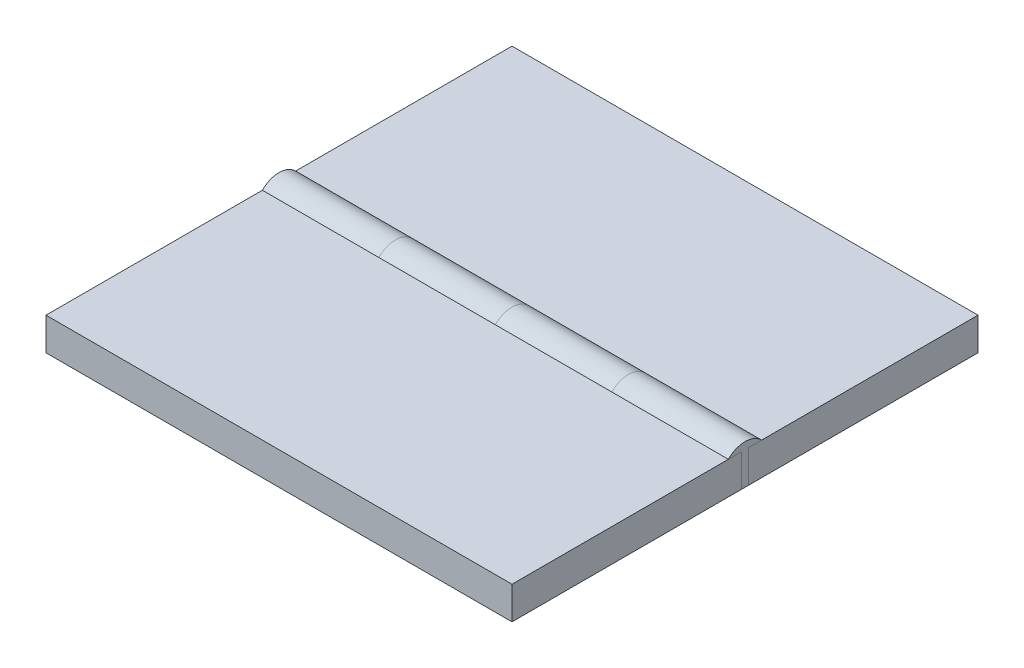
ISO-10303-21;
HEADER;
FILE_DESCRIPTION(('STEP AP214'),'2;1');
FILE_NAME('part.step','',(''),(''),'','','');
FILE_SCHEMA(('AUTOMOTIVE_DESIGN { 1 0 10303 214 1 1 1 1 }'));
ENDSEC;
DATA;
#1=APPLICATION_CONTEXT('core data for automotive mechanical design processes');
#2=APPLICATION_PROTOCOL_DEFINITION('international standard','automotive_design',2000,#1);
#3=PRODUCT_CONTEXT('',#1,'mechanical');
#4=PRODUCT('Part','Part','',(#3));
#5=PRODUCT_RELATED_PRODUCT_CATEGORY('part','',(#4));
#6=PRODUCT_DEFINITION_FORMATION('','',#4);
#7=PRODUCT_DEFINITION_CONTEXT('part definition',#1,'design');
#8=PRODUCT_DEFINITION('design','',#6,#7);
#9=PRODUCT_DEFINITION_SHAPE('','',#8);
#10=(LENGTH_UNIT() NAMED_UNIT(*) SI_UNIT(.MILLI.,.METRE.));
#11=(NAMED_UNIT(*) PLANE_ANGLE_UNIT() SI_UNIT($,.RADIAN.));
#12=(NAMED_UNIT(*) SI_UNIT($,.STERADIAN.) SOLID_ANGLE_UNIT());
#13=UNCERTAINTY_MEASURE_WITH_UNIT(LENGTH_MEASURE(1.E-05),#10,'distance_accuracy_value','');
#14=(GEOMETRIC_REPRESENTATION_CONTEXT(3) GLOBAL_UNCERTAINTY_ASSIGNED_CONTEXT((#13)) GLOBAL_UNIT_ASSIGNED_CONTEXT((#10,
#11,#12)) REPRESENTATION_CONTEXT('',''));
#15=CARTESIAN_POINT('',(0.,0.,0.));
#16=DIRECTION('',(0.,0.,1.));
#17=DIRECTION('',(1.,0.,0.));
#18=AXIS2_PLACEMENT_3D('',#15,#16,#17);
#19=CARTESIAN_POINT('',(100.,0.,0.));
#20=DIRECTION('',(-1.,0.,0.));
#21=DIRECTION('',(0.,0.,1.));
#22=AXIS2_PLACEMENT_3D('',#19,#20,#21);
#23=CYLINDRICAL_SURFACE('',#22,5.);
#24=CARTESIAN_POINT('',(75.,0.,0.));
#25=DIRECTION('',(1.,0.,0.));
#26=DIRECTION('',(0.,0.,-1.));
#27=AXIS2_PLACEMENT_3D('',#24,#25,#26);
#28=CIRCLE('',#27,5.);
#29=CARTESIAN_POINT('',(75.,3.5,-3.57071421427142));
#30=VERTEX_POINT('',#29);
#31=CARTESIAN_POINT('',(75.,3.5,3.57071421427143));
#32=VERTEX_POINT('',#31);
#33=EDGE_CURVE('E130',#30,#32,#28,.T.);
#34=ORIENTED_EDGE('',*,*,#33,.T.);
#35=DIRECTION('',(-1.,0.,0.));
#36=VECTOR('',#35,1.);
#37=CARTESIAN_POINT('',(100.,3.5,3.57071421427143));
#38=LINE('',#37,#36);
#39=CARTESIAN_POINT('',(100.,3.5,3.57071421427143));
#40=VERTEX_POINT('',#39);
#41=EDGE_CURVE('E12',#40,#32,#38,.T.);
#42=ORIENTED_EDGE('',*,*,#41,.F.);
#43=CARTESIAN_POINT('',(100.,0.,0.));
#44=DIRECTION('',(1.,0.,0.));
#45=DIRECTION('',(0.,0.,-1.));
#46=AXIS2_PLACEMENT_3D('',#43,#44,#45);
#47=CIRCLE('',#46,5.);
#48=CARTESIAN_POINT('',(100.,3.5,-3.57071421427142));
#49=VERTEX_POINT('',#48);
#50=EDGE_CURVE('E140',#49,#40,#47,.T.);
#51=ORIENTED_EDGE('',*,*,#50,.F.);
#52=DIRECTION('',(-1.,0.,0.));
#53=VECTOR('',#52,1.);
#54=CARTESIAN_POINT('',(100.,3.5,-3.57071421427142));
#55=LINE('',#54,#53);
#56=EDGE_CURVE('E126',#49,#30,#55,.T.);
#57=ORIENTED_EDGE('',*,*,#56,.T.);
#58=EDGE_LOOP('',(#34,#42,#51,#57));
#59=FACE_BOUND('',#58,.T.);
#60=ADVANCED_FACE('F46',(#59),#23,.T.);
#61=CARTESIAN_POINT('',(100.,3.5,3.57071421427143));
#62=DIRECTION('',(0.,1.,0.));
#63=DIRECTION('',(0.,0.,1.));
#64=AXIS2_PLACEMENT_3D('',#61,#62,#63);
#65=PLANE('',#64);
#66=DIRECTION('',(0.,0.,-1.));
#67=VECTOR('',#66,1.);
#68=CARTESIAN_POINT('',(75.,3.5,3.57071421427143));
#69=LINE('',#68,#67);
#70=CARTESIAN_POINT('',(75.,3.5,0.750000000000007));
#71=VERTEX_POINT('',#70);
#72=EDGE_CURVE('E133',#32,#71,#69,.T.);
#73=ORIENTED_EDGE('',*,*,#72,.T.);
#74=DIRECTION('',(-1.,0.,0.));
#75=VECTOR('',#74,1.);
#76=CARTESIAN_POINT('',(100.,3.5,0.750000000000007));
#77=LINE('',#76,#75);
#78=CARTESIAN_POINT('',(100.,3.5,0.750000000000007));
#79=VERTEX_POINT('',#78);
#80=EDGE_CURVE('E54',#79,#71,#77,.T.);
#81=ORIENTED_EDGE('',*,*,#80,.F.);
#82=DIRECTION('',(0.,0.,-1.));
#83=VECTOR('',#82,1.);
#84=CARTESIAN_POINT('',(100.,3.5,3.57071421427143));
#85=LINE('',#84,#83);
#86=EDGE_CURVE('E99',#40,#79,#85,.T.);
#87=ORIENTED_EDGE('',*,*,#86,.F.);
#88=ORIENTED_EDGE('',*,*,#41,.T.);
#89=EDGE_LOOP('',(#73,#81,#87,#88));
#90=FACE_BOUND('',#89,.T.);
#91=ADVANCED_FACE('F164',(#90),#65,.F.);
#92=CARTESIAN_POINT('',(100.,3.5,0.750000000000007));
#93=DIRECTION('',(0.,0.,-1.));
#94=DIRECTION('',(-1.,0.,0.));
#95=AXIS2_PLACEMENT_3D('',#92,#93,#94);
#96=PLANE('',#95);
#97=DIRECTION('',(0.,-1.,0.));
#98=VECTOR('',#97,1.);
#99=CARTESIAN_POINT('',(75.,3.5,0.750000000000007));
#100=LINE('',#99,#98);
#101=CARTESIAN_POINT('',(75.,-3.5,0.750000000000007));
#102=VERTEX_POINT('',#101);
#103=EDGE_CURVE('E135',#71,#102,#100,.T.);
#104=ORIENTED_EDGE('',*,*,#103,.T.);
#105=DIRECTION('',(-1.,0.,0.));
#106=VECTOR('',#105,1.);
#107=CARTESIAN_POINT('',(100.,-3.5,0.750000000000007));
#108=LINE('',#107,#106);
#109=CARTESIAN_POINT('',(100.,-3.5,0.750000000000007));
#110=VERTEX_POINT('',#109);
#111=EDGE_CURVE('E121',#110,#102,#108,.T.);
#112=ORIENTED_EDGE('',*,*,#111,.F.);
#113=DIRECTION('',(0.,-1.,0.));
#114=VECTOR('',#113,1.);
#115=CARTESIAN_POINT('',(100.,3.5,0.750000000000007));
#116=LINE('',#115,#114);
#117=EDGE_CURVE('E112',#79,#110,#116,.T.);
#118=ORIENTED_EDGE('',*,*,#117,.F.);
#119=ORIENTED_EDGE('',*,*,#80,.T.);
#120=EDGE_LOOP('',(#104,#112,#118,#119));
#121=FACE_BOUND('',#120,.T.);
#122=ADVANCED_FACE('F146',(#121),#96,.F.);
#123=CARTESIAN_POINT('',(100.,-3.5,0.750000000000007));
#124=DIRECTION('',(0.,1.,0.));
#125=DIRECTION('',(0.,0.,1.));
#126=AXIS2_PLACEMENT_3D('',#123,#124,#125);
#127=PLANE('',#126);
#128=DIRECTION('',(0.,0.,-1.));
#129=VECTOR('',#128,1.);
#130=CARTESIAN_POINT('',(75.,-3.5,0.750000000000007));
#131=LINE('',#130,#129);
#132=CARTESIAN_POINT('',(75.,-3.5,-0.749999999999993));
#133=VERTEX_POINT('',#132);
#134=EDGE_CURVE('E120',#102,#133,#131,.T.);
#135=ORIENTED_EDGE('',*,*,#134,.T.);
#136=DIRECTION('',(-1.,0.,0.));
#137=VECTOR('',#136,1.);
#138=CARTESIAN_POINT('',(100.,-3.5,-0.749999999999993));
#139=LINE('',#138,#137);
#140=CARTESIAN_POINT('',(100.,-3.5,-0.749999999999993));
#141=VERTEX_POINT('',#140);
#142=EDGE_CURVE('E117',#141,#133,#139,.T.);
#143=ORIENTED_EDGE('',*,*,#142,.F.);
#144=DIRECTION('',(0.,0.,-1.));
#145=VECTOR('',#144,1.);
#146=CARTESIAN_POINT('',(100.,-3.5,0.750000000000007));
#147=LINE('',#146,#145);
#148=EDGE_CURVE('E106',#110,#141,#147,.T.);
#149=ORIENTED_EDGE('',*,*,#148,.F.);
#150=ORIENTED_EDGE('',*,*,#111,.T.);
#151=EDGE_LOOP('',(#135,#143,#149,#150));
#152=FACE_BOUND('',#151,.T.);
#153=ADVANCED_FACE('F118',(#152),#127,.F.);
#154=CARTESIAN_POINT('',(100.,-3.5,-0.749999999999993));
#155=DIRECTION('',(0.,0.,1.));
#156=DIRECTION('',(1.,0.,0.));
#157=AXIS2_PLACEMENT_3D('',#154,#155,#156);
#158=PLANE('',#157);
#159=DIRECTION('',(0.,1.,0.));
#160=VECTOR('',#159,1.);
#161=CARTESIAN_POINT('',(75.,-3.5,-0.749999999999993));
#162=LINE('',#161,#160);
#163=CARTESIAN_POINT('',(75.,3.5,-0.749999999999993));
#164=VERTEX_POINT('',#163);
#165=EDGE_CURVE('E85',#133,#164,#162,.T.);
#166=ORIENTED_EDGE('',*,*,#165,.T.);
#167=DIRECTION('',(-1.,0.,0.));
#168=VECTOR('',#167,1.);
#169=CARTESIAN_POINT('',(100.,3.5,-0.749999999999993));
#170=LINE('',#169,#168);
#171=CARTESIAN_POINT('',(100.,3.5,-0.749999999999993));
#172=VERTEX_POINT('',#171);
#173=EDGE_CURVE('E122',#172,#164,#170,.T.);
#174=ORIENTED_EDGE('',*,*,#173,.F.);
#175=DIRECTION('',(0.,1.,0.));
#176=VECTOR('',#175,1.);
#177=CARTESIAN_POINT('',(100.,-3.5,-0.749999999999993));
#178=LINE('',#177,#176);
#179=EDGE_CURVE('E110',#141,#172,#178,.T.);
#180=ORIENTED_EDGE('',*,*,#179,.F.);
#181=ORIENTED_EDGE('',*,*,#142,.T.);
#182=EDGE_LOOP('',(#166,#174,#180,#181));
#183=FACE_BOUND('',#182,.T.);
#184=ADVANCED_FACE('F124',(#183),#158,.F.);
#185=CARTESIAN_POINT('',(100.,3.5,-0.749999999999993));
#186=DIRECTION('',(0.,1.,0.));
#187=DIRECTION('',(0.,0.,1.));
#188=AXIS2_PLACEMENT_3D('',#185,#186,#187);
#189=PLANE('',#188);
#190=DIRECTION('',(0.,0.,-1.));
#191=VECTOR('',#190,1.);
#192=CARTESIAN_POINT('',(75.,3.5,-0.749999999999993));
#193=LINE('',#192,#191);
#194=EDGE_CURVE('E91',#164,#30,#193,.T.);
#195=ORIENTED_EDGE('',*,*,#194,.T.);
#196=ORIENTED_EDGE('',*,*,#56,.F.);
#197=DIRECTION('',(0.,0.,-1.));
#198=VECTOR('',#197,1.);
#199=CARTESIAN_POINT('',(100.,3.5,-0.749999999999993));
#200=LINE('',#199,#198);
#201=EDGE_CURVE('E62',#172,#49,#200,.T.);
#202=ORIENTED_EDGE('',*,*,#201,.F.);
#203=ORIENTED_EDGE('',*,*,#173,.T.);
#204=EDGE_LOOP('',(#195,#196,#202,#203));
#205=FACE_BOUND('',#204,.T.);
#206=ADVANCED_FACE('F153',(#205),#189,.F.);
#207=CARTESIAN_POINT('',(100.,0.,0.));
#208=DIRECTION('',(1.,0.,0.));
#209=DIRECTION('',(0.,0.,-1.));
#210=AXIS2_PLACEMENT_3D('',#207,#208,#209);
#211=PLANE('',#210);
#212=ORIENTED_EDGE('',*,*,#50,.T.);
#213=ORIENTED_EDGE('',*,*,#86,.T.);
#214=ORIENTED_EDGE('',*,*,#117,.T.);
#215=ORIENTED_EDGE('',*,*,#148,.T.);
#216=ORIENTED_EDGE('',*,*,#179,.T.);
#217=ORIENTED_EDGE('',*,*,#201,.T.);
#218=EDGE_LOOP('',(#212,#213,#214,#215,#216,#217));
#219=FACE_BOUND('',#218,.T.);
#220=ADVANCED_FACE('F108',(#219),#211,.T.);
#221=CARTESIAN_POINT('',(75.,0.,0.));
#222=DIRECTION('',(1.,0.,0.));
#223=DIRECTION('',(0.,0.,-1.));
#224=AXIS2_PLACEMENT_3D('',#221,#222,#223);
#225=PLANE('',#224);
#226=ORIENTED_EDGE('',*,*,#33,.F.);
#227=ORIENTED_EDGE('',*,*,#194,.F.);
#228=ORIENTED_EDGE('',*,*,#165,.F.);
#229=ORIENTED_EDGE('',*,*,#134,.F.);
#230=ORIENTED_EDGE('',*,*,#103,.F.);
#231=ORIENTED_EDGE('',*,*,#72,.F.);
#232=EDGE_LOOP('',(#226,#227,#228,#229,#230,#231));
#233=FACE_BOUND('',#232,.T.);
#234=ADVANCED_FACE('F149',(#233),#225,.F.);
#235=CLOSED_SHELL('',(#60,#91,#122,#153,#184,#206,#220,#234));
#236=MANIFOLD_SOLID_BREP('B2',#235);
#237=CARTESIAN_POINT('',(75.,0.,0.));
#238=DIRECTION('',(-1.,0.,0.));
#239=DIRECTION('',(0.,0.,1.));
#240=AXIS2_PLACEMENT_3D('',#237,#238,#239);
#241=CYLINDRICAL_SURFACE('',#240,5.);
#242=CARTESIAN_POINT('',(50.,0.,0.));
#243=DIRECTION('',(1.,0.,0.));
#244=DIRECTION('',(0.,0.,-1.));
#245=AXIS2_PLACEMENT_3D('',#242,#243,#244);
#246=CIRCLE('',#245,5.);
#247=CARTESIAN_POINT('',(50.,3.5,-3.57071421427142));
#248=VERTEX_POINT('',#247);
#249=CARTESIAN_POINT('',(50.,3.5,3.57071421427143));
#250=VERTEX_POINT('',#249);
#251=EDGE_CURVE('E316',#248,#250,#246,.T.);
#252=ORIENTED_EDGE('',*,*,#251,.T.);
#253=DIRECTION('',(-1.,0.,0.));
#254=VECTOR('',#253,1.);
#255=CARTESIAN_POINT('',(75.,3.5,3.57071421427143));
#256=LINE('',#255,#254);
#257=CARTESIAN_POINT('',(75.,3.5,3.57071421427143));
#258=VERTEX_POINT('',#257);
#259=EDGE_CURVE('E44',#258,#250,#256,.T.);
#260=ORIENTED_EDGE('',*,*,#259,.F.);
#261=CARTESIAN_POINT('',(75.,0.,0.));
#262=DIRECTION('',(1.,0.,0.));
#263=DIRECTION('',(0.,0.,-1.));
#264=AXIS2_PLACEMENT_3D('',#261,#262,#263);
#265=CIRCLE('',#264,5.);
#266=CARTESIAN_POINT('',(75.,3.5,-3.57071421427142));
#267=VERTEX_POINT('',#266);
#268=EDGE_CURVE('E326',#267,#258,#265,.T.);
#269=ORIENTED_EDGE('',*,*,#268,.F.);
#270=DIRECTION('',(-1.,0.,0.));
#271=VECTOR('',#270,1.);
#272=CARTESIAN_POINT('',(75.,3.5,-3.57071421427142));
#273=LINE('',#272,#271);
#274=EDGE_CURVE('E312',#267,#248,#273,.T.);
#275=ORIENTED_EDGE('',*,*,#274,.T.);
#276=EDGE_LOOP('',(#252,#260,#269,#275));
#277=FACE_BOUND('',#276,.T.);
#278=ADVANCED_FACE('F232',(#277),#241,.T.);
#279=CARTESIAN_POINT('',(75.,3.5,3.57071421427143));
#280=DIRECTION('',(0.,1.,0.));
#281=DIRECTION('',(0.,0.,1.));
#282=AXIS2_PLACEMENT_3D('',#279,#280,#281);
#283=PLANE('',#282);
#284=DIRECTION('',(0.,0.,-1.));
#285=VECTOR('',#284,1.);
#286=CARTESIAN_POINT('',(50.,3.5,3.57071421427143));
#287=LINE('',#286,#285);
#288=CARTESIAN_POINT('',(50.,3.5,0.750000000000007));
#289=VERTEX_POINT('',#288);
#290=EDGE_CURVE('E319',#250,#289,#287,.T.);
#291=ORIENTED_EDGE('',*,*,#290,.T.);
#292=DIRECTION('',(-1.,0.,0.));
#293=VECTOR('',#292,1.);
#294=CARTESIAN_POINT('',(75.,3.5,0.750000000000007));
#295=LINE('',#294,#293);
#296=CARTESIAN_POINT('',(75.,3.5,0.750000000000007));
#297=VERTEX_POINT('',#296);
#298=EDGE_CURVE('E240',#297,#289,#295,.T.);
#299=ORIENTED_EDGE('',*,*,#298,.F.);
#300=DIRECTION('',(0.,0.,-1.));
#301=VECTOR('',#300,1.);
#302=CARTESIAN_POINT('',(75.,3.5,3.57071421427143));
#303=LINE('',#302,#301);
#304=EDGE_CURVE('E285',#258,#297,#303,.T.);
#305=ORIENTED_EDGE('',*,*,#304,.F.);
#306=ORIENTED_EDGE('',*,*,#259,.T.);
#307=EDGE_LOOP('',(#291,#299,#305,#306));
#308=FACE_BOUND('',#307,.T.);
#309=ADVANCED_FACE('F350',(#308),#283,.F.);
#310=CARTESIAN_POINT('',(75.,3.5,0.750000000000007));
#311=DIRECTION('',(0.,0.,-1.));
#312=DIRECTION('',(-1.,0.,0.));
#313=AXIS2_PLACEMENT_3D('',#310,#311,#312);
#314=PLANE('',#313);
#315=DIRECTION('',(0.,-1.,0.));
#316=VECTOR('',#315,1.);
#317=CARTESIAN_POINT('',(50.,3.5,0.750000000000007));
#318=LINE('',#317,#316);
#319=CARTESIAN_POINT('',(50.,-3.5,0.750000000000007));
#320=VERTEX_POINT('',#319);
#321=EDGE_CURVE('E321',#289,#320,#318,.T.);
#322=ORIENTED_EDGE('',*,*,#321,.T.);
#323=DIRECTION('',(-1.,0.,0.));
#324=VECTOR('',#323,1.);
#325=CARTESIAN_POINT('',(75.,-3.5,0.750000000000007));
#326=LINE('',#325,#324);
#327=CARTESIAN_POINT('',(75.,-3.5,0.750000000000007));
#328=VERTEX_POINT('',#327);
#329=EDGE_CURVE('E307',#328,#320,#326,.T.);
#330=ORIENTED_EDGE('',*,*,#329,.F.);
#331=DIRECTION('',(0.,-1.,0.));
#332=VECTOR('',#331,1.);
#333=CARTESIAN_POINT('',(75.,3.5,0.750000000000007));
#334=LINE('',#333,#332);
#335=EDGE_CURVE('E298',#297,#328,#334,.T.);
#336=ORIENTED_EDGE('',*,*,#335,.F.);
#337=ORIENTED_EDGE('',*,*,#298,.T.);
#338=EDGE_LOOP('',(#322,#330,#336,#337));
#339=FACE_BOUND('',#338,.T.);
#340=ADVANCED_FACE('F332',(#339),#314,.F.);
#341=CARTESIAN_POINT('',(75.,-3.5,0.750000000000007));
#342=DIRECTION('',(0.,1.,0.));
#343=DIRECTION('',(0.,0.,1.));
#344=AXIS2_PLACEMENT_3D('',#341,#342,#343);
#345=PLANE('',#344);
#346=DIRECTION('',(0.,0.,-1.));
#347=VECTOR('',#346,1.);
#348=CARTESIAN_POINT('',(50.,-3.5,0.750000000000007));
#349=LINE('',#348,#347);
#350=CARTESIAN_POINT('',(50.,-3.5,-0.749999999999993));
#351=VERTEX_POINT('',#350);
#352=EDGE_CURVE('E306',#320,#351,#349,.T.);
#353=ORIENTED_EDGE('',*,*,#352,.T.);
#354=DIRECTION('',(-1.,0.,0.));
#355=VECTOR('',#354,1.);
#356=CARTESIAN_POINT('',(75.,-3.5,-0.749999999999993));
#357=LINE('',#356,#355);
#358=CARTESIAN_POINT('',(75.,-3.5,-0.749999999999993));
#359=VERTEX_POINT('',#358);
#360=EDGE_CURVE('E303',#359,#351,#357,.T.);
#361=ORIENTED_EDGE('',*,*,#360,.F.);
#362=DIRECTION('',(0.,0.,-1.));
#363=VECTOR('',#362,1.);
#364=CARTESIAN_POINT('',(75.,-3.5,0.750000000000007));
#365=LINE('',#364,#363);
#366=EDGE_CURVE('E292',#328,#359,#365,.T.);
#367=ORIENTED_EDGE('',*,*,#366,.F.);
#368=ORIENTED_EDGE('',*,*,#329,.T.);
#369=EDGE_LOOP('',(#353,#361,#367,#368));
#370=FACE_BOUND('',#369,.T.);
#371=ADVANCED_FACE('F304',(#370),#345,.F.);
#372=CARTESIAN_POINT('',(75.,-3.5,-0.749999999999993));
#373=DIRECTION('',(0.,0.,1.));
#374=DIRECTION('',(1.,0.,0.));
#375=AXIS2_PLACEMENT_3D('',#372,#373,#374);
#376=PLANE('',#375);
#377=DIRECTION('',(0.,1.,0.));
#378=VECTOR('',#377,1.);
#379=CARTESIAN_POINT('',(50.,-3.5,-0.749999999999993));
#380=LINE('',#379,#378);
#381=CARTESIAN_POINT('',(50.,3.5,-0.749999999999993));
#382=VERTEX_POINT('',#381);
#383=EDGE_CURVE('E271',#351,#382,#380,.T.);
#384=ORIENTED_EDGE('',*,*,#383,.T.);
#385=DIRECTION('',(-1.,0.,0.));
#386=VECTOR('',#385,1.);
#387=CARTESIAN_POINT('',(75.,3.5,-0.749999999999993));
#388=LINE('',#387,#386);
#389=CARTESIAN_POINT('',(75.,3.5,-0.749999999999993));
#390=VERTEX_POINT('',#389);
#391=EDGE_CURVE('E308',#390,#382,#388,.T.);
#392=ORIENTED_EDGE('',*,*,#391,.F.);
#393=DIRECTION('',(0.,1.,0.));
#394=VECTOR('',#393,1.);
#395=CARTESIAN_POINT('',(75.,-3.5,-0.749999999999993));
#396=LINE('',#395,#394);
#397=EDGE_CURVE('E296',#359,#390,#396,.T.);
#398=ORIENTED_EDGE('',*,*,#397,.F.);
#399=ORIENTED_EDGE('',*,*,#360,.T.);
#400=EDGE_LOOP('',(#384,#392,#398,#399));
#401=FACE_BOUND('',#400,.T.);
#402=ADVANCED_FACE('F310',(#401),#376,.F.);
#403=CARTESIAN_POINT('',(75.,3.5,-0.749999999999993));
#404=DIRECTION('',(0.,1.,0.));
#405=DIRECTION('',(0.,0.,1.));
#406=AXIS2_PLACEMENT_3D('',#403,#404,#405);
#407=PLANE('',#406);
#408=DIRECTION('',(0.,0.,-1.));
#409=VECTOR('',#408,1.);
#410=CARTESIAN_POINT('',(50.,3.5,-0.749999999999993));
#411=LINE('',#410,#409);
#412=EDGE_CURVE('E277',#382,#248,#411,.T.);
#413=ORIENTED_EDGE('',*,*,#412,.T.);
#414=ORIENTED_EDGE('',*,*,#274,.F.);
#415=DIRECTION('',(0.,0.,-1.));
#416=VECTOR('',#415,1.);
#417=CARTESIAN_POINT('',(75.,3.5,-0.749999999999993));
#418=LINE('',#417,#416);
#419=EDGE_CURVE('E248',#390,#267,#418,.T.);
#420=ORIENTED_EDGE('',*,*,#419,.F.);
#421=ORIENTED_EDGE('',*,*,#391,.T.);
#422=EDGE_LOOP('',(#413,#414,#420,#421));
#423=FACE_BOUND('',#422,.T.);
#424=ADVANCED_FACE('F339',(#423),#407,.F.);
#425=CARTESIAN_POINT('',(75.,0.,0.));
#426=DIRECTION('',(1.,0.,0.));
#427=DIRECTION('',(0.,0.,-1.));
#428=AXIS2_PLACEMENT_3D('',#425,#426,#427);
#429=PLANE('',#428);
#430=ORIENTED_EDGE('',*,*,#268,.T.);
#431=ORIENTED_EDGE('',*,*,#304,.T.);
#432=ORIENTED_EDGE('',*,*,#335,.T.);
#433=ORIENTED_EDGE('',*,*,#366,.T.);
#434=ORIENTED_EDGE('',*,*,#397,.T.);
#435=ORIENTED_EDGE('',*,*,#419,.T.);
#436=EDGE_LOOP('',(#430,#431,#432,#433,#434,#435));
#437=FACE_BOUND('',#436,.T.);
#438=ADVANCED_FACE('F294',(#437),#429,.T.);
#439=CARTESIAN_POINT('',(50.,0.,0.));
#440=DIRECTION('',(1.,0.,0.));
#441=DIRECTION('',(0.,0.,-1.));
#442=AXIS2_PLACEMENT_3D('',#439,#440,#441);
#443=PLANE('',#442);
#444=ORIENTED_EDGE('',*,*,#251,.F.);
#445=ORIENTED_EDGE('',*,*,#412,.F.);
#446=ORIENTED_EDGE('',*,*,#383,.F.);
#447=ORIENTED_EDGE('',*,*,#352,.F.);
#448=ORIENTED_EDGE('',*,*,#321,.F.);
#449=ORIENTED_EDGE('',*,*,#290,.F.);
#450=EDGE_LOOP('',(#444,#445,#446,#447,#448,#449));
#451=FACE_BOUND('',#450,.T.);
#452=ADVANCED_FACE('F335',(#451),#443,.F.);
#453=CLOSED_SHELL('',(#278,#309,#340,#371,#402,#424,#438,#452));
#454=MANIFOLD_SOLID_BREP('B6',#453);
#455=CARTESIAN_POINT('',(50.,0.,0.));
#456=DIRECTION('',(-1.,0.,0.));
#457=DIRECTION('',(0.,0.,1.));
#458=AXIS2_PLACEMENT_3D('',#455,#456,#457);
#459=CYLINDRICAL_SURFACE('',#458,5.);
#460=CARTESIAN_POINT('',(25.,0.,0.));
#461=DIRECTION('',(1.,0.,0.));
#462=DIRECTION('',(0.,0.,-1.));
#463=AXIS2_PLACEMENT_3D('',#460,#461,#462);
#464=CIRCLE('',#463,5.);
#465=CARTESIAN_POINT('',(25.,3.5,-3.57071421427142));
#466=VERTEX_POINT('',#465);
#467=CARTESIAN_POINT('',(25.,3.5,3.57071421427143));
#468=VERTEX_POINT('',#467);
#469=EDGE_CURVE('E502',#466,#468,#464,.T.);
#470=ORIENTED_EDGE('',*,*,#469,.T.);
#471=DIRECTION('',(-1.,0.,0.));
#472=VECTOR('',#471,1.);
#473=CARTESIAN_POINT('',(50.,3.5,3.57071421427143));
#474=LINE('',#473,#472);
#475=CARTESIAN_POINT('',(50.,3.5,3.57071421427143));
#476=VERTEX_POINT('',#475);
#477=EDGE_CURVE('E230',#476,#468,#474,.T.);
#478=ORIENTED_EDGE('',*,*,#477,.F.);
#479=CARTESIAN_POINT('',(50.,0.,0.));
#480=DIRECTION('',(1.,0.,0.));
#481=DIRECTION('',(0.,0.,-1.));
#482=AXIS2_PLACEMENT_3D('',#479,#480,#481);
#483=CIRCLE('',#482,5.);
#484=CARTESIAN_POINT('',(50.,3.5,-3.57071421427142));
#485=VERTEX_POINT('',#484);
#486=EDGE_CURVE('E512',#485,#476,#483,.T.);
#487=ORIENTED_EDGE('',*,*,#486,.F.);
#488=DIRECTION('',(-1.,0.,0.));
#489=VECTOR('',#488,1.);
#490=CARTESIAN_POINT('',(50.,3.5,-3.57071421427142));
#491=LINE('',#490,#489);
#492=EDGE_CURVE('E498',#485,#466,#491,.T.);
#493=ORIENTED_EDGE('',*,*,#492,.T.);
#494=EDGE_LOOP('',(#470,#478,#487,#493));
#495=FACE_BOUND('',#494,.T.);
#496=ADVANCED_FACE('F418',(#495),#459,.T.);
#497=CARTESIAN_POINT('',(50.,3.5,3.57071421427143));
#498=DIRECTION('',(0.,1.,0.));
#499=DIRECTION('',(0.,0.,1.));
#500=AXIS2_PLACEMENT_3D('',#497,#498,#499);
#501=PLANE('',#500);
#502=DIRECTION('',(0.,0.,-1.));
#503=VECTOR('',#502,1.);
#504=CARTESIAN_POINT('',(25.,3.5,3.57071421427143));
#505=LINE('',#504,#503);
#506=CARTESIAN_POINT('',(25.,3.5,0.750000000000007));
#507=VERTEX_POINT('',#506);
#508=EDGE_CURVE('E505',#468,#507,#505,.T.);
#509=ORIENTED_EDGE('',*,*,#508,.T.);
#510=DIRECTION('',(-1.,0.,0.));
#511=VECTOR('',#510,1.);
#512=CARTESIAN_POINT('',(50.,3.5,0.750000000000007));
#513=LINE('',#512,#511);
#514=CARTESIAN_POINT('',(50.,3.5,0.750000000000007));
#515=VERTEX_POINT('',#514);
#516=EDGE_CURVE('E426',#515,#507,#513,.T.);
#517=ORIENTED_EDGE('',*,*,#516,.F.);
#518=DIRECTION('',(0.,0.,-1.));
#519=VECTOR('',#518,1.);
#520=CARTESIAN_POINT('',(50.,3.5,3.57071421427143));
#521=LINE('',#520,#519);
#522=EDGE_CURVE('E471',#476,#515,#521,.T.);
#523=ORIENTED_EDGE('',*,*,#522,.F.);
#524=ORIENTED_EDGE('',*,*,#477,.T.);
#525=EDGE_LOOP('',(#509,#517,#523,#524));
#526=FACE_BOUND('',#525,.T.);
#527=ADVANCED_FACE('F536',(#526),#501,.F.);
#528=CARTESIAN_POINT('',(50.,3.5,0.750000000000007));
#529=DIRECTION('',(0.,0.,-1.));
#530=DIRECTION('',(-1.,0.,0.));
#531=AXIS2_PLACEMENT_3D('',#528,#529,#530);
#532=PLANE('',#531);
#533=DIRECTION('',(0.,-1.,0.));
#534=VECTOR('',#533,1.);
#535=CARTESIAN_POINT('',(25.,3.5,0.750000000000007));
#536=LINE('',#535,#534);
#537=CARTESIAN_POINT('',(25.,-3.5,0.750000000000007));
#538=VERTEX_POINT('',#537);
#539=EDGE_CURVE('E507',#507,#538,#536,.T.);
#540=ORIENTED_EDGE('',*,*,#539,.T.);
#541=DIRECTION('',(-1.,0.,0.));
#542=VECTOR('',#541,1.);
#543=CARTESIAN_POINT('',(50.,-3.5,0.750000000000007));
#544=LINE('',#543,#542);
#545=CARTESIAN_POINT('',(50.,-3.5,0.750000000000007));
#546=VERTEX_POINT('',#545);
#547=EDGE_CURVE('E493',#546,#538,#544,.T.);
#548=ORIENTED_EDGE('',*,*,#547,.F.);
#549=DIRECTION('',(0.,-1.,0.));
#550=VECTOR('',#549,1.);
#551=CARTESIAN_POINT('',(50.,3.5,0.750000000000007));
#552=LINE('',#551,#550);
#553=EDGE_CURVE('E484',#515,#546,#552,.T.);
#554=ORIENTED_EDGE('',*,*,#553,.F.);
#555=ORIENTED_EDGE('',*,*,#516,.T.);
#556=EDGE_LOOP('',(#540,#548,#554,#555));
#557=FACE_BOUND('',#556,.T.);
#558=ADVANCED_FACE('F518',(#557),#532,.F.);
#559=CARTESIAN_POINT('',(50.,-3.5,0.750000000000007));
#560=DIRECTION('',(0.,1.,0.));
#561=DIRECTION('',(0.,0.,1.));
#562=AXIS2_PLACEMENT_3D('',#559,#560,#561);
#563=PLANE('',#562);
#564=DIRECTION('',(0.,0.,-1.));
#565=VECTOR('',#564,1.);
#566=CARTESIAN_POINT('',(25.,-3.5,0.750000000000007));
#567=LINE('',#566,#565);
#568=CARTESIAN_POINT('',(25.,-3.5,-0.749999999999993));
#569=VERTEX_POINT('',#568);
#570=EDGE_CURVE('E492',#538,#569,#567,.T.);
#571=ORIENTED_EDGE('',*,*,#570,.T.);
#572=DIRECTION('',(-1.,0.,0.));
#573=VECTOR('',#572,1.);
#574=CARTESIAN_POINT('',(50.,-3.5,-0.749999999999993));
#575=LINE('',#574,#573);
#576=CARTESIAN_POINT('',(50.,-3.5,-0.749999999999993));
#577=VERTEX_POINT('',#576);
#578=EDGE_CURVE('E489',#577,#569,#575,.T.);
#579=ORIENTED_EDGE('',*,*,#578,.F.);
#580=DIRECTION('',(0.,0.,-1.));
#581=VECTOR('',#580,1.);
#582=CARTESIAN_POINT('',(50.,-3.5,0.750000000000007));
#583=LINE('',#582,#581);
#584=EDGE_CURVE('E478',#546,#577,#583,.T.);
#585=ORIENTED_EDGE('',*,*,#584,.F.);
#586=ORIENTED_EDGE('',*,*,#547,.T.);
#587=EDGE_LOOP('',(#571,#579,#585,#586));
#588=FACE_BOUND('',#587,.T.);
#589=ADVANCED_FACE('F490',(#588),#563,.F.);
#590=CARTESIAN_POINT('',(50.,-3.5,-0.749999999999993));
#591=DIRECTION('',(0.,0.,1.));
#592=DIRECTION('',(1.,0.,0.));
#593=AXIS2_PLACEMENT_3D('',#590,#591,#592);
#594=PLANE('',#593);
#595=DIRECTION('',(0.,1.,0.));
#596=VECTOR('',#595,1.);
#597=CARTESIAN_POINT('',(25.,-3.5,-0.749999999999993));
#598=LINE('',#597,#596);
#599=CARTESIAN_POINT('',(25.,3.5,-0.749999999999993));
#600=VERTEX_POINT('',#599);
#601=EDGE_CURVE('E457',#569,#600,#598,.T.);
#602=ORIENTED_EDGE('',*,*,#601,.T.);
#603=DIRECTION('',(-1.,0.,0.));
#604=VECTOR('',#603,1.);
#605=CARTESIAN_POINT('',(50.,3.5,-0.749999999999993));
#606=LINE('',#605,#604);
#607=CARTESIAN_POINT('',(50.,3.5,-0.749999999999993));
#608=VERTEX_POINT('',#607);
#609=EDGE_CURVE('E494',#608,#600,#606,.T.);
#610=ORIENTED_EDGE('',*,*,#609,.F.);
#611=DIRECTION('',(0.,1.,0.));
#612=VECTOR('',#611,1.);
#613=CARTESIAN_POINT('',(50.,-3.5,-0.749999999999993));
#614=LINE('',#613,#612);
#615=EDGE_CURVE('E482',#577,#608,#614,.T.);
#616=ORIENTED_EDGE('',*,*,#615,.F.);
#617=ORIENTED_EDGE('',*,*,#578,.T.);
#618=EDGE_LOOP('',(#602,#610,#616,#617));
#619=FACE_BOUND('',#618,.T.);
#620=ADVANCED_FACE('F496',(#619),#594,.F.);
#621=CARTESIAN_POINT('',(50.,3.5,-0.749999999999993));
#622=DIRECTION('',(0.,1.,0.));
#623=DIRECTION('',(0.,0.,1.));
#624=AXIS2_PLACEMENT_3D('',#621,#622,#623);
#625=PLANE('',#624);
#626=DIRECTION('',(0.,0.,-1.));
#627=VECTOR('',#626,1.);
#628=CARTESIAN_POINT('',(25.,3.5,-0.749999999999993));
#629=LINE('',#628,#627);
#630=EDGE_CURVE('E463',#600,#466,#629,.T.);
#631=ORIENTED_EDGE('',*,*,#630,.T.);
#632=ORIENTED_EDGE('',*,*,#492,.F.);
#633=DIRECTION('',(0.,0.,-1.));
#634=VECTOR('',#633,1.);
#635=CARTESIAN_POINT('',(50.,3.5,-0.749999999999993));
#636=LINE('',#635,#634);
#637=EDGE_CURVE('E434',#608,#485,#636,.T.);
#638=ORIENTED_EDGE('',*,*,#637,.F.);
#639=ORIENTED_EDGE('',*,*,#609,.T.);
#640=EDGE_LOOP('',(#631,#632,#638,#639));
#641=FACE_BOUND('',#640,.T.);
#642=ADVANCED_FACE('F525',(#641),#625,.F.);
#643=CARTESIAN_POINT('',(50.,0.,0.));
#644=DIRECTION('',(1.,0.,0.));
#645=DIRECTION('',(0.,0.,-1.));
#646=AXIS2_PLACEMENT_3D('',#643,#644,#645);
#647=PLANE('',#646);
#648=ORIENTED_EDGE('',*,*,#486,.T.);
#649=ORIENTED_EDGE('',*,*,#522,.T.);
#650=ORIENTED_EDGE('',*,*,#553,.T.);
#651=ORIENTED_EDGE('',*,*,#584,.T.);
#652=ORIENTED_EDGE('',*,*,#615,.T.);
#653=ORIENTED_EDGE('',*,*,#637,.T.);
#654=EDGE_LOOP('',(#648,#649,#650,#651,#652,#653));
#655=FACE_BOUND('',#654,.T.);
#656=ADVANCED_FACE('F480',(#655),#647,.T.);
#657=CARTESIAN_POINT('',(25.,0.,0.));
#658=DIRECTION('',(1.,0.,0.));
#659=DIRECTION('',(0.,0.,-1.));
#660=AXIS2_PLACEMENT_3D('',#657,#658,#659);
#661=PLANE('',#660);
#662=ORIENTED_EDGE('',*,*,#469,.F.);
#663=ORIENTED_EDGE('',*,*,#630,.F.);
#664=ORIENTED_EDGE('',*,*,#601,.F.);
#665=ORIENTED_EDGE('',*,*,#570,.F.);
#666=ORIENTED_EDGE('',*,*,#539,.F.);
#667=ORIENTED_EDGE('',*,*,#508,.F.);
#668=EDGE_LOOP('',(#662,#663,#664,#665,#666,#667));
#669=FACE_BOUND('',#668,.T.);
#670=ADVANCED_FACE('F521',(#669),#661,.F.);
#671=CLOSED_SHELL('',(#496,#527,#558,#589,#620,#642,#656,#670));
#672=MANIFOLD_SOLID_BREP('B38',#671);
#673=CARTESIAN_POINT('',(25.,3.5,0.));
#674=DIRECTION('',(0.,1.,0.));
#675=DIRECTION('',(0.,0.,1.));
#676=AXIS2_PLACEMENT_3D('',#673,#674,#675);
#677=PLANE('',#676);
#678=DIRECTION('',(0.,0.,-1.));
#679=VECTOR('',#678,1.);
#680=CARTESIAN_POINT('',(0.,3.5,0.));
#681=LINE('',#680,#679);
#682=CARTESIAN_POINT('',(0.,3.5,3.57071421427143));
#683=VERTEX_POINT('',#682);
#684=CARTESIAN_POINT('',(0.,3.5,0.750000000000007));
#685=VERTEX_POINT('',#684);
#686=EDGE_CURVE('E688',#683,#685,#681,.T.);
#687=ORIENTED_EDGE('',*,*,#686,.T.);
#688=DIRECTION('',(-1.,0.,0.));
#689=VECTOR('',#688,1.);
#690=CARTESIAN_POINT('',(25.,3.5,0.750000000000007));
#691=LINE('',#690,#689);
#692=CARTESIAN_POINT('',(25.,3.5,0.750000000000007));
#693=VERTEX_POINT('',#692);
#694=EDGE_CURVE('E416',#693,#685,#691,.T.);
#695=ORIENTED_EDGE('',*,*,#694,.F.);
#696=DIRECTION('',(0.,0.,-1.));
#697=VECTOR('',#696,1.);
#698=CARTESIAN_POINT('',(25.,3.5,0.));
#699=LINE('',#698,#697);
#700=CARTESIAN_POINT('',(25.,3.5,3.57071421427143));
#701=VERTEX_POINT('',#700);
#702=EDGE_CURVE('E622',#701,#693,#699,.T.);
#703=ORIENTED_EDGE('',*,*,#702,.F.);
#704=DIRECTION('',(-1.,0.,0.));
#705=VECTOR('',#704,1.);
#706=CARTESIAN_POINT('',(25.,3.5,3.57071421427143));
#707=LINE('',#706,#705);
#708=EDGE_CURVE('E607',#701,#683,#707,.T.);
#709=ORIENTED_EDGE('',*,*,#708,.T.);
#710=EDGE_LOOP('',(#687,#695,#703,#709));
#711=FACE_BOUND('',#710,.T.);
#712=ADVANCED_FACE('F604',(#711),#677,.F.);
#713=CARTESIAN_POINT('',(25.,0.,0.750000000000007));
#714=DIRECTION('',(0.,0.,1.));
#715=DIRECTION('',(1.,0.,0.));
#716=AXIS2_PLACEMENT_3D('',#713,#714,#715);
#717=PLANE('',#716);
#718=DIRECTION('',(0.,1.,0.));
#719=VECTOR('',#718,1.);
#720=CARTESIAN_POINT('',(0.,0.,0.750000000000007));
#721=LINE('',#720,#719);
#722=CARTESIAN_POINT('',(0.,-3.5,0.750000000000007));
#723=VERTEX_POINT('',#722);
#724=EDGE_CURVE('E699',#723,#685,#721,.T.);
#725=ORIENTED_EDGE('',*,*,#724,.F.);
#726=DIRECTION('',(-1.,0.,0.));
#727=VECTOR('',#726,1.);
#728=CARTESIAN_POINT('',(25.,-3.5,0.750000000000007));
#729=LINE('',#728,#727);
#730=CARTESIAN_POINT('',(25.,-3.5,0.750000000000007));
#731=VERTEX_POINT('',#730);
#732=EDGE_CURVE('E613',#731,#723,#729,.T.);
#733=ORIENTED_EDGE('',*,*,#732,.F.);
#734=DIRECTION('',(0.,1.,0.));
#735=VECTOR('',#734,1.);
#736=CARTESIAN_POINT('',(25.,0.,0.750000000000007));
#737=LINE('',#736,#735);
#738=EDGE_CURVE('E668',#731,#693,#737,.T.);
#739=ORIENTED_EDGE('',*,*,#738,.T.);
#740=ORIENTED_EDGE('',*,*,#694,.T.);
#741=EDGE_LOOP('',(#725,#733,#739,#740));
#742=FACE_BOUND('',#741,.T.);
#743=ADVANCED_FACE('F721',(#742),#717,.T.);
#744=CARTESIAN_POINT('',(25.,-3.5,0.));
#745=DIRECTION('',(0.,1.,0.));
#746=DIRECTION('',(0.,0.,1.));
#747=AXIS2_PLACEMENT_3D('',#744,#745,#746);
#748=PLANE('',#747);
#749=DIRECTION('',(0.,0.,-1.));
#750=VECTOR('',#749,1.);
#751=CARTESIAN_POINT('',(0.,-3.5,0.));
#752=LINE('',#751,#750);
#753=CARTESIAN_POINT('',(0.,-3.5,-0.749999999999993));
#754=VERTEX_POINT('',#753);
#755=EDGE_CURVE('E673',#723,#754,#752,.T.);
#756=ORIENTED_EDGE('',*,*,#755,.T.);
#757=DIRECTION('',(-1.,0.,0.));
#758=VECTOR('',#757,1.);
#759=CARTESIAN_POINT('',(25.,-3.5,-0.749999999999993));
#760=LINE('',#759,#758);
#761=CARTESIAN_POINT('',(25.,-3.5,-0.749999999999993));
#762=VERTEX_POINT('',#761);
#763=EDGE_CURVE('E671',#762,#754,#760,.T.);
#764=ORIENTED_EDGE('',*,*,#763,.F.);
#765=DIRECTION('',(0.,0.,-1.));
#766=VECTOR('',#765,1.);
#767=CARTESIAN_POINT('',(25.,-3.5,0.));
#768=LINE('',#767,#766);
#769=EDGE_CURVE('E662',#731,#762,#768,.T.);
#770=ORIENTED_EDGE('',*,*,#769,.F.);
#771=ORIENTED_EDGE('',*,*,#732,.T.);
#772=EDGE_LOOP('',(#756,#764,#770,#771));
#773=FACE_BOUND('',#772,.T.);
#774=ADVANCED_FACE('F672',(#773),#748,.F.);
#775=CARTESIAN_POINT('',(25.,0.,-0.749999999999993));
#776=DIRECTION('',(0.,0.,1.));
#777=DIRECTION('',(0.,-1.,0.));
#778=AXIS2_PLACEMENT_3D('',#775,#776,#777);
#779=PLANE('',#778);
#780=DIRECTION('',(0.,1.,0.));
#781=VECTOR('',#780,1.);
#782=CARTESIAN_POINT('',(0.,0.,-0.749999999999993));
#783=LINE('',#782,#781);
#784=CARTESIAN_POINT('',(0.,3.5,-0.749999999999993));
#785=VERTEX_POINT('',#784);
#786=EDGE_CURVE('E696',#754,#785,#783,.T.);
#787=ORIENTED_EDGE('',*,*,#786,.T.);
#788=DIRECTION('',(-1.,0.,0.));
#789=VECTOR('',#788,1.);
#790=CARTESIAN_POINT('',(25.,3.5,-0.749999999999993));
#791=LINE('',#790,#789);
#792=CARTESIAN_POINT('',(25.,3.5,-0.749999999999993));
#793=VERTEX_POINT('',#792);
#794=EDGE_CURVE('E676',#793,#785,#791,.T.);
#795=ORIENTED_EDGE('',*,*,#794,.F.);
#796=DIRECTION('',(0.,1.,0.));
#797=VECTOR('',#796,1.);
#798=CARTESIAN_POINT('',(25.,0.,-0.749999999999993));
#799=LINE('',#798,#797);
#800=EDGE_CURVE('E666',#762,#793,#799,.T.);
#801=ORIENTED_EDGE('',*,*,#800,.F.);
#802=ORIENTED_EDGE('',*,*,#763,.T.);
#803=EDGE_LOOP('',(#787,#795,#801,#802));
#804=FACE_BOUND('',#803,.T.);
#805=ADVANCED_FACE('F678',(#804),#779,.F.);
#806=CARTESIAN_POINT('',(25.,3.5,0.));
#807=DIRECTION('',(0.,1.,0.));
#808=DIRECTION('',(0.,0.,1.));
#809=AXIS2_PLACEMENT_3D('',#806,#807,#808);
#810=PLANE('',#809);
#811=DIRECTION('',(0.,0.,-1.));
#812=VECTOR('',#811,1.);
#813=CARTESIAN_POINT('',(0.,3.5,0.));
#814=LINE('',#813,#812);
#815=CARTESIAN_POINT('',(0.,3.5,-3.57071421427142));
#816=VERTEX_POINT('',#815);
#817=EDGE_CURVE('E693',#785,#816,#814,.T.);
#818=ORIENTED_EDGE('',*,*,#817,.T.);
#819=DIRECTION('',(-1.,0.,0.));
#820=VECTOR('',#819,1.);
#821=CARTESIAN_POINT('',(25.,3.5,-3.57071421427142));
#822=LINE('',#821,#820);
#823=CARTESIAN_POINT('',(25.,3.5,-3.57071421427142));
#824=VERTEX_POINT('',#823);
#825=EDGE_CURVE('E703',#824,#816,#822,.T.);
#826=ORIENTED_EDGE('',*,*,#825,.F.);
#827=DIRECTION('',(0.,0.,-1.));
#828=VECTOR('',#827,1.);
#829=CARTESIAN_POINT('',(25.,3.5,0.));
#830=LINE('',#829,#828);
#831=EDGE_CURVE('E681',#793,#824,#830,.T.);
#832=ORIENTED_EDGE('',*,*,#831,.F.);
#833=ORIENTED_EDGE('',*,*,#794,.T.);
#834=EDGE_LOOP('',(#818,#826,#832,#833));
#835=FACE_BOUND('',#834,.T.);
#836=ADVANCED_FACE('F712',(#835),#810,.F.);
#837=CARTESIAN_POINT('',(25.,0.,0.));
#838=DIRECTION('',(-1.,0.,0.));
#839=DIRECTION('',(0.,0.,1.));
#840=AXIS2_PLACEMENT_3D('',#837,#838,#839);
#841=CYLINDRICAL_SURFACE('',#840,5.);
#842=CARTESIAN_POINT('',(0.,0.,0.));
#843=DIRECTION('',(-1.,0.,0.));
#844=DIRECTION('',(0.,0.,1.));
#845=AXIS2_PLACEMENT_3D('',#842,#843,#844);
#846=CIRCLE('',#845,5.);
#847=EDGE_CURVE('E690',#683,#816,#846,.T.);
#848=ORIENTED_EDGE('',*,*,#847,.F.);
#849=ORIENTED_EDGE('',*,*,#708,.F.);
#850=CARTESIAN_POINT('',(25.,0.,0.));
#851=DIRECTION('',(-1.,0.,0.));
#852=DIRECTION('',(0.,0.,1.));
#853=AXIS2_PLACEMENT_3D('',#850,#851,#852);
#854=CIRCLE('',#853,5.);
#855=EDGE_CURVE('E683',#701,#824,#854,.T.);
#856=ORIENTED_EDGE('',*,*,#855,.T.);
#857=ORIENTED_EDGE('',*,*,#825,.T.);
#858=EDGE_LOOP('',(#848,#849,#856,#857));
#859=FACE_BOUND('',#858,.T.);
#860=ADVANCED_FACE('F710',(#859),#841,.T.);
#861=CARTESIAN_POINT('',(25.,0.,0.));
#862=DIRECTION('',(-1.,0.,0.));
#863=DIRECTION('',(0.,0.,1.));
#864=AXIS2_PLACEMENT_3D('',#861,#862,#863);
#865=PLANE('',#864);
#866=ORIENTED_EDGE('',*,*,#702,.T.);
#867=ORIENTED_EDGE('',*,*,#738,.F.);
#868=ORIENTED_EDGE('',*,*,#769,.T.);
#869=ORIENTED_EDGE('',*,*,#800,.T.);
#870=ORIENTED_EDGE('',*,*,#831,.T.);
#871=ORIENTED_EDGE('',*,*,#855,.F.);
#872=EDGE_LOOP('',(#866,#867,#868,#869,#870,#871));
#873=FACE_BOUND('',#872,.T.);
#874=ADVANCED_FACE('F664',(#873),#865,.F.);
#875=CARTESIAN_POINT('',(0.,0.,0.));
#876=DIRECTION('',(-1.,0.,0.));
#877=DIRECTION('',(0.,0.,1.));
#878=AXIS2_PLACEMENT_3D('',#875,#876,#877);
#879=PLANE('',#878);
#880=ORIENTED_EDGE('',*,*,#686,.F.);
#881=ORIENTED_EDGE('',*,*,#847,.T.);
#882=ORIENTED_EDGE('',*,*,#817,.F.);
#883=ORIENTED_EDGE('',*,*,#786,.F.);
#884=ORIENTED_EDGE('',*,*,#755,.F.);
#885=ORIENTED_EDGE('',*,*,#724,.T.);
#886=EDGE_LOOP('',(#880,#881,#882,#883,#884,#885));
#887=FACE_BOUND('',#886,.T.);
#888=ADVANCED_FACE('F708',(#887),#879,.T.);
#889=CLOSED_SHELL('',(#712,#743,#774,#805,#836,#860,#874,#888));
#890=MANIFOLD_SOLID_BREP('B224',#889);
#891=CARTESIAN_POINT('',(100.,0.,-0.749999999999993));
#892=DIRECTION('',(0.,0.,-1.));
#893=DIRECTION('',(0.,1.,0.));
#894=AXIS2_PLACEMENT_3D('',#891,#892,#893);
#895=PLANE('',#894);
#896=DIRECTION('',(0.,-1.,0.));
#897=VECTOR('',#896,1.);
#898=CARTESIAN_POINT('',(0.,0.,-0.749999999999993));
#899=LINE('',#898,#897);
#900=CARTESIAN_POINT('',(0.,3.5,-0.749999999999993));
#901=VERTEX_POINT('',#900);
#902=CARTESIAN_POINT('',(0.,-3.5,-0.749999999999993));
#903=VERTEX_POINT('',#902);
#904=EDGE_CURVE('E858',#901,#903,#899,.T.);
#905=ORIENTED_EDGE('',*,*,#904,.T.);
#906=DIRECTION('',(-1.,0.,0.));
#907=VECTOR('',#906,1.);
#908=CARTESIAN_POINT('',(100.,-3.5,-0.749999999999993));
#909=LINE('',#908,#907);
#910=CARTESIAN_POINT('',(100.,-3.5,-0.749999999999993));
#911=VERTEX_POINT('',#910);
#912=EDGE_CURVE('E602',#911,#903,#909,.T.);
#913=ORIENTED_EDGE('',*,*,#912,.F.);
#914=DIRECTION('',(0.,-1.,0.));
#915=VECTOR('',#914,1.);
#916=CARTESIAN_POINT('',(100.,0.,-0.749999999999993));
#917=LINE('',#916,#915);
#918=CARTESIAN_POINT('',(100.,3.5,-0.749999999999993));
#919=VERTEX_POINT('',#918);
#920=EDGE_CURVE('E844',#919,#911,#917,.T.);
#921=ORIENTED_EDGE('',*,*,#920,.F.);
#922=DIRECTION('',(-1.,0.,0.));
#923=VECTOR('',#922,1.);
#924=CARTESIAN_POINT('',(100.,3.5,-0.749999999999993));
#925=LINE('',#924,#923);
#926=EDGE_CURVE('E811',#919,#901,#925,.T.);
#927=ORIENTED_EDGE('',*,*,#926,.T.);
#928=EDGE_LOOP('',(#905,#913,#921,#927));
#929=FACE_BOUND('',#928,.T.);
#930=ADVANCED_FACE('F795',(#929),#895,.F.);
#931=CARTESIAN_POINT('',(100.,-3.5,0.));
#932=DIRECTION('',(0.,1.,0.));
#933=DIRECTION('',(0.,0.,1.));
#934=AXIS2_PLACEMENT_3D('',#931,#932,#933);
#935=PLANE('',#934);
#936=DIRECTION('',(0.,0.,-1.));
#937=VECTOR('',#936,1.);
#938=CARTESIAN_POINT('',(0.,-3.5,0.));
#939=LINE('',#938,#937);
#940=CARTESIAN_POINT('',(0.,-3.5,-50.));
#941=VERTEX_POINT('',#940);
#942=EDGE_CURVE('E849',#903,#941,#939,.T.);
#943=ORIENTED_EDGE('',*,*,#942,.T.);
#944=DIRECTION('',(-1.,0.,0.));
#945=VECTOR('',#944,1.);
#946=CARTESIAN_POINT('',(100.,-3.5,-50.));
#947=LINE('',#946,#945);
#948=CARTESIAN_POINT('',(100.,-3.5,-50.));
#949=VERTEX_POINT('',#948);
#950=EDGE_CURVE('E803',#949,#941,#947,.T.);
#951=ORIENTED_EDGE('',*,*,#950,.F.);
#952=DIRECTION('',(0.,0.,-1.));
#953=VECTOR('',#952,1.);
#954=CARTESIAN_POINT('',(100.,-3.5,0.));
#955=LINE('',#954,#953);
#956=EDGE_CURVE('E837',#911,#949,#955,.T.);
#957=ORIENTED_EDGE('',*,*,#956,.F.);
#958=ORIENTED_EDGE('',*,*,#912,.T.);
#959=EDGE_LOOP('',(#943,#951,#957,#958));
#960=FACE_BOUND('',#959,.T.);
#961=ADVANCED_FACE('F848',(#960),#935,.F.);
#962=CARTESIAN_POINT('',(100.,0.,-50.));
#963=DIRECTION('',(0.,0.,1.));
#964=DIRECTION('',(1.,0.,0.));
#965=AXIS2_PLACEMENT_3D('',#962,#963,#964);
#966=PLANE('',#965);
#967=DIRECTION('',(0.,1.,0.));
#968=VECTOR('',#967,1.);
#969=CARTESIAN_POINT('',(0.,0.,-50.));
#970=LINE('',#969,#968);
#971=CARTESIAN_POINT('',(0.,3.5,-50.));
#972=VERTEX_POINT('',#971);
#973=EDGE_CURVE('E861',#941,#972,#970,.T.);
#974=ORIENTED_EDGE('',*,*,#973,.T.);
#975=DIRECTION('',(-1.,0.,0.));
#976=VECTOR('',#975,1.);
#977=CARTESIAN_POINT('',(100.,3.5,-50.));
#978=LINE('',#977,#976);
#979=CARTESIAN_POINT('',(100.,3.5,-50.));
#980=VERTEX_POINT('',#979);
#981=EDGE_CURVE('E826',#980,#972,#978,.T.);
#982=ORIENTED_EDGE('',*,*,#981,.F.);
#983=DIRECTION('',(0.,1.,0.));
#984=VECTOR('',#983,1.);
#985=CARTESIAN_POINT('',(100.,0.,-50.));
#986=LINE('',#985,#984);
#987=EDGE_CURVE('E843',#949,#980,#986,.T.);
#988=ORIENTED_EDGE('',*,*,#987,.F.);
#989=ORIENTED_EDGE('',*,*,#950,.T.);
#990=EDGE_LOOP('',(#974,#982,#988,#989));
#991=FACE_BOUND('',#990,.T.);
#992=ADVANCED_FACE('F852',(#991),#966,.F.);
#993=CARTESIAN_POINT('',(100.,3.5,0.));
#994=DIRECTION('',(0.,1.,0.));
#995=DIRECTION('',(0.,0.,1.));
#996=AXIS2_PLACEMENT_3D('',#993,#994,#995);
#997=PLANE('',#996);
#998=DIRECTION('',(0.,0.,-1.));
#999=VECTOR('',#998,1.);
#1000=CARTESIAN_POINT('',(0.,3.5,0.));
#1001=LINE('',#1000,#999);
#1002=EDGE_CURVE('E863',#901,#972,#1001,.T.);
#1003=ORIENTED_EDGE('',*,*,#1002,.F.);
#1004=ORIENTED_EDGE('',*,*,#926,.F.);
#1005=DIRECTION('',(0.,0.,-1.));
#1006=VECTOR('',#1005,1.);
#1007=CARTESIAN_POINT('',(100.,3.5,0.));
#1008=LINE('',#1007,#1006);
#1009=EDGE_CURVE('E853',#919,#980,#1008,.T.);
#1010=ORIENTED_EDGE('',*,*,#1009,.T.);
#1011=ORIENTED_EDGE('',*,*,#981,.T.);
#1012=EDGE_LOOP('',(#1003,#1004,#1010,#1011));
#1013=FACE_BOUND('',#1012,.T.);
#1014=ADVANCED_FACE('F869',(#1013),#997,.T.);
#1015=CARTESIAN_POINT('',(100.,0.,0.));
#1016=DIRECTION('',(1.,0.,0.));
#1017=DIRECTION('',(0.,0.,-1.));
#1018=AXIS2_PLACEMENT_3D('',#1015,#1016,#1017);
#1019=PLANE('',#1018);
#1020=ORIENTED_EDGE('',*,*,#920,.T.);
#1021=ORIENTED_EDGE('',*,*,#956,.T.);
#1022=ORIENTED_EDGE('',*,*,#987,.T.);
#1023=ORIENTED_EDGE('',*,*,#1009,.F.);
#1024=EDGE_LOOP('',(#1020,#1021,#1022,#1023));
#1025=FACE_BOUND('',#1024,.T.);
#1026=ADVANCED_FACE('F840',(#1025),#1019,.T.);
#1027=CARTESIAN_POINT('',(0.,0.,0.));
#1028=DIRECTION('',(1.,0.,0.));
#1029=DIRECTION('',(0.,0.,-1.));
#1030=AXIS2_PLACEMENT_3D('',#1027,#1028,#1029);
#1031=PLANE('',#1030);
#1032=ORIENTED_EDGE('',*,*,#904,.F.);
#1033=ORIENTED_EDGE('',*,*,#1002,.T.);
#1034=ORIENTED_EDGE('',*,*,#973,.F.);
#1035=ORIENTED_EDGE('',*,*,#942,.F.);
#1036=EDGE_LOOP('',(#1032,#1033,#1034,#1035));
#1037=FACE_BOUND('',#1036,.T.);
#1038=ADVANCED_FACE('F868',(#1037),#1031,.F.);
#1039=CLOSED_SHELL('',(#930,#961,#992,#1014,#1026,#1038));
#1040=MANIFOLD_SOLID_BREP('B410',#1039);
#1041=CARTESIAN_POINT('',(100.,-3.5,0.));
#1042=DIRECTION('',(0.,1.,0.));
#1043=DIRECTION('',(0.,0.,1.));
#1044=AXIS2_PLACEMENT_3D('',#1041,#1042,#1043);
#1045=PLANE('',#1044);
#1046=DIRECTION('',(0.,0.,-1.));
#1047=VECTOR('',#1046,1.);
#1048=CARTESIAN_POINT('',(0.,-3.5,0.));
#1049=LINE('',#1048,#1047);
#1050=CARTESIAN_POINT('',(0.,-3.5,50.));
#1051=VERTEX_POINT('',#1050);
#1052=CARTESIAN_POINT('',(0.,-3.5,0.750000000000007));
#1053=VERTEX_POINT('',#1052);
#1054=EDGE_CURVE('E982',#1051,#1053,#1049,.T.);
#1055=ORIENTED_EDGE('',*,*,#1054,.T.);
#1056=DIRECTION('',(-1.,0.,0.));
#1057=VECTOR('',#1056,1.);
#1058=CARTESIAN_POINT('',(100.,-3.5,0.750000000000007));
#1059=LINE('',#1058,#1057);
#1060=CARTESIAN_POINT('',(100.,-3.5,0.750000000000007));
#1061=VERTEX_POINT('',#1060);
#1062=EDGE_CURVE('E793',#1061,#1053,#1059,.T.);
#1063=ORIENTED_EDGE('',*,*,#1062,.F.);
#1064=DIRECTION('',(0.,0.,-1.));
#1065=VECTOR('',#1064,1.);
#1066=CARTESIAN_POINT('',(100.,-3.5,0.));
#1067=LINE('',#1066,#1065);
#1068=CARTESIAN_POINT('',(100.,-3.5,50.));
#1069=VERTEX_POINT('',#1068);
#1070=EDGE_CURVE('E968',#1069,#1061,#1067,.T.);
#1071=ORIENTED_EDGE('',*,*,#1070,.F.);
#1072=DIRECTION('',(-1.,0.,0.));
#1073=VECTOR('',#1072,1.);
#1074=CARTESIAN_POINT('',(100.,-3.5,50.));
#1075=LINE('',#1074,#1073);
#1076=EDGE_CURVE('E935',#1069,#1051,#1075,.T.);
#1077=ORIENTED_EDGE('',*,*,#1076,.T.);
#1078=EDGE_LOOP('',(#1055,#1063,#1071,#1077));
#1079=FACE_BOUND('',#1078,.T.);
#1080=ADVANCED_FACE('F919',(#1079),#1045,.F.);
#1081=CARTESIAN_POINT('',(100.,0.,0.750000000000007));
#1082=DIRECTION('',(0.,0.,1.));
#1083=DIRECTION('',(1.,0.,0.));
#1084=AXIS2_PLACEMENT_3D('',#1081,#1082,#1083);
#1085=PLANE('',#1084);
#1086=DIRECTION('',(0.,1.,0.));
#1087=VECTOR('',#1086,1.);
#1088=CARTESIAN_POINT('',(0.,0.,0.750000000000007));
#1089=LINE('',#1088,#1087);
#1090=CARTESIAN_POINT('',(0.,3.5,0.750000000000007));
#1091=VERTEX_POINT('',#1090);
#1092=EDGE_CURVE('E973',#1053,#1091,#1089,.T.);
#1093=ORIENTED_EDGE('',*,*,#1092,.T.);
#1094=DIRECTION('',(-1.,0.,0.));
#1095=VECTOR('',#1094,1.);
#1096=CARTESIAN_POINT('',(100.,3.5,0.750000000000007));
#1097=LINE('',#1096,#1095);
#1098=CARTESIAN_POINT('',(100.,3.5,0.750000000000007));
#1099=VERTEX_POINT('',#1098);
#1100=EDGE_CURVE('E927',#1099,#1091,#1097,.T.);
#1101=ORIENTED_EDGE('',*,*,#1100,.F.);
#1102=DIRECTION('',(0.,1.,0.));
#1103=VECTOR('',#1102,1.);
#1104=CARTESIAN_POINT('',(100.,0.,0.750000000000007));
#1105=LINE('',#1104,#1103);
#1106=EDGE_CURVE('E960',#1061,#1099,#1105,.T.);
#1107=ORIENTED_EDGE('',*,*,#1106,.F.);
#1108=ORIENTED_EDGE('',*,*,#1062,.T.);
#1109=EDGE_LOOP('',(#1093,#1101,#1107,#1108));
#1110=FACE_BOUND('',#1109,.T.);
#1111=ADVANCED_FACE('F972',(#1110),#1085,.F.);
#1112=CARTESIAN_POINT('',(100.,3.5,0.));
#1113=DIRECTION('',(0.,1.,0.));
#1114=DIRECTION('',(0.,0.,1.));
#1115=AXIS2_PLACEMENT_3D('',#1112,#1113,#1114);
#1116=PLANE('',#1115);
#1117=DIRECTION('',(0.,0.,-1.));
#1118=VECTOR('',#1117,1.);
#1119=CARTESIAN_POINT('',(0.,3.5,0.));
#1120=LINE('',#1119,#1118);
#1121=CARTESIAN_POINT('',(0.,3.5,50.));
#1122=VERTEX_POINT('',#1121);
#1123=EDGE_CURVE('E985',#1122,#1091,#1120,.T.);
#1124=ORIENTED_EDGE('',*,*,#1123,.F.);
#1125=DIRECTION('',(-1.,0.,0.));
#1126=VECTOR('',#1125,1.);
#1127=CARTESIAN_POINT('',(100.,3.5,50.));
#1128=LINE('',#1127,#1126);
#1129=CARTESIAN_POINT('',(100.,3.5,50.));
#1130=VERTEX_POINT('',#1129);
#1131=EDGE_CURVE('E949',#1130,#1122,#1128,.T.);
#1132=ORIENTED_EDGE('',*,*,#1131,.F.);
#1133=DIRECTION('',(0.,0.,-1.));
#1134=VECTOR('',#1133,1.);
#1135=CARTESIAN_POINT('',(100.,3.5,0.));
#1136=LINE('',#1135,#1134);
#1137=EDGE_CURVE('E967',#1130,#1099,#1136,.T.);
#1138=ORIENTED_EDGE('',*,*,#1137,.T.);
#1139=ORIENTED_EDGE('',*,*,#1100,.T.);
#1140=EDGE_LOOP('',(#1124,#1132,#1138,#1139));
#1141=FACE_BOUND('',#1140,.T.);
#1142=ADVANCED_FACE('F976',(#1141),#1116,.T.);
#1143=CARTESIAN_POINT('',(100.,0.,50.));
#1144=DIRECTION('',(0.,0.,1.));
#1145=DIRECTION('',(1.,0.,0.));
#1146=AXIS2_PLACEMENT_3D('',#1143,#1144,#1145);
#1147=PLANE('',#1146);
#1148=DIRECTION('',(0.,1.,0.));
#1149=VECTOR('',#1148,1.);
#1150=CARTESIAN_POINT('',(0.,0.,50.));
#1151=LINE('',#1150,#1149);
#1152=EDGE_CURVE('E987',#1051,#1122,#1151,.T.);
#1153=ORIENTED_EDGE('',*,*,#1152,.F.);
#1154=ORIENTED_EDGE('',*,*,#1076,.F.);
#1155=DIRECTION('',(0.,1.,0.));
#1156=VECTOR('',#1155,1.);
#1157=CARTESIAN_POINT('',(100.,0.,50.));
#1158=LINE('',#1157,#1156);
#1159=EDGE_CURVE('E977',#1069,#1130,#1158,.T.);
#1160=ORIENTED_EDGE('',*,*,#1159,.T.);
#1161=ORIENTED_EDGE('',*,*,#1131,.T.);
#1162=EDGE_LOOP('',(#1153,#1154,#1160,#1161));
#1163=FACE_BOUND('',#1162,.T.);
#1164=ADVANCED_FACE('F993',(#1163),#1147,.T.);
#1165=CARTESIAN_POINT('',(100.,0.,0.));
#1166=DIRECTION('',(1.,0.,0.));
#1167=DIRECTION('',(0.,0.,-1.));
#1168=AXIS2_PLACEMENT_3D('',#1165,#1166,#1167);
#1169=PLANE('',#1168);
#1170=ORIENTED_EDGE('',*,*,#1070,.T.);
#1171=ORIENTED_EDGE('',*,*,#1106,.T.);
#1172=ORIENTED_EDGE('',*,*,#1137,.F.);
#1173=ORIENTED_EDGE('',*,*,#1159,.F.);
#1174=EDGE_LOOP('',(#1170,#1171,#1172,#1173));
#1175=FACE_BOUND('',#1174,.T.);
#1176=ADVANCED_FACE('F964',(#1175),#1169,.T.);
#1177=CARTESIAN_POINT('',(0.,0.,0.));
#1178=DIRECTION('',(1.,0.,0.));
#1179=DIRECTION('',(0.,0.,-1.));
#1180=AXIS2_PLACEMENT_3D('',#1177,#1178,#1179);
#1181=PLANE('',#1180);
#1182=ORIENTED_EDGE('',*,*,#1054,.F.);
#1183=ORIENTED_EDGE('',*,*,#1152,.T.);
#1184=ORIENTED_EDGE('',*,*,#1123,.T.);
#1185=ORIENTED_EDGE('',*,*,#1092,.F.);
#1186=EDGE_LOOP('',(#1182,#1183,#1184,#1185));
#1187=FACE_BOUND('',#1186,.T.);
#1188=ADVANCED_FACE('F992',(#1187),#1181,.F.);
#1189=CLOSED_SHELL('',(#1080,#1111,#1142,#1164,#1176,#1188));
#1190=MANIFOLD_SOLID_BREP('B596',#1189);
#1191=ADVANCED_BREP_SHAPE_REPRESENTATION('',(#18,#236,#454,#672,#890,#1040,#1190),#14);
#1192=SHAPE_DEFINITION_REPRESENTATION(#9,#1191);
ENDSEC;
END-ISO-10303-21;
